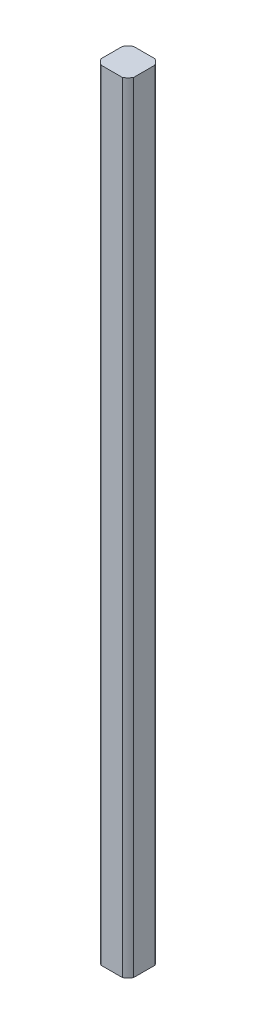
ISO-10303-21;
HEADER;
FILE_DESCRIPTION(('STEP AP214'),'2;1');
FILE_NAME('part.step','',(''),(''),'','','');
FILE_SCHEMA(('AUTOMOTIVE_DESIGN { 1 0 10303 214 1 1 1 1 }'));
ENDSEC;
DATA;
#1=APPLICATION_CONTEXT('core data for automotive mechanical design processes');
#2=APPLICATION_PROTOCOL_DEFINITION('international standard','automotive_design',2000,#1);
#3=PRODUCT_CONTEXT('',#1,'mechanical');
#4=PRODUCT('Part','Part','',(#3));
#5=PRODUCT_RELATED_PRODUCT_CATEGORY('part','',(#4));
#6=PRODUCT_DEFINITION_FORMATION('','',#4);
#7=PRODUCT_DEFINITION_CONTEXT('part definition',#1,'design');
#8=PRODUCT_DEFINITION('design','',#6,#7);
#9=PRODUCT_DEFINITION_SHAPE('','',#8);
#10=(LENGTH_UNIT() NAMED_UNIT(*) SI_UNIT(.MILLI.,.METRE.));
#11=(NAMED_UNIT(*) PLANE_ANGLE_UNIT() SI_UNIT($,.RADIAN.));
#12=(NAMED_UNIT(*) SI_UNIT($,.STERADIAN.) SOLID_ANGLE_UNIT());
#13=UNCERTAINTY_MEASURE_WITH_UNIT(LENGTH_MEASURE(1.E-05),#10,'distance_accuracy_value','');
#14=(GEOMETRIC_REPRESENTATION_CONTEXT(3) GLOBAL_UNCERTAINTY_ASSIGNED_CONTEXT((#13)) GLOBAL_UNIT_ASSIGNED_CONTEXT((#10,
#11,#12)) REPRESENTATION_CONTEXT('',''));
#15=CARTESIAN_POINT('',(0.,0.,0.));
#16=DIRECTION('',(0.,0.,1.));
#17=DIRECTION('',(1.,0.,0.));
#18=AXIS2_PLACEMENT_3D('',#15,#16,#17);
#19=CARTESIAN_POINT('',(0.,2400.,0.));
#20=DIRECTION('',(0.,-1.,0.));
#21=DIRECTION('',(0.,0.,-1.));
#22=AXIS2_PLACEMENT_3D('',#19,#20,#21);
#23=CYLINDRICAL_SURFACE('',#22,60.);
#24=CARTESIAN_POINT('',(0.,0.,0.));
#25=DIRECTION('',(0.,1.,0.));
#26=DIRECTION('',(0.,0.,1.));
#27=AXIS2_PLACEMENT_3D('',#24,#25,#26);
#28=CIRCLE('',#27,60.);
#29=CARTESIAN_POINT('',(-50.,0.,33.166247903554));
#30=VERTEX_POINT('',#29);
#31=CARTESIAN_POINT('',(-33.166247903554,0.,50.));
#32=VERTEX_POINT('',#31);
#33=EDGE_CURVE('E152',#30,#32,#28,.T.);
#34=ORIENTED_EDGE('',*,*,#33,.T.);
#35=DIRECTION('',(0.,-1.,0.));
#36=VECTOR('',#35,1.);
#37=CARTESIAN_POINT('',(-33.166247903554,2400.,50.));
#38=LINE('',#37,#36);
#39=CARTESIAN_POINT('',(-33.166247903554,2400.,50.));
#40=VERTEX_POINT('',#39);
#41=EDGE_CURVE('E12',#40,#32,#38,.T.);
#42=ORIENTED_EDGE('',*,*,#41,.F.);
#43=CARTESIAN_POINT('',(0.,2400.,0.));
#44=DIRECTION('',(0.,1.,0.));
#45=DIRECTION('',(0.,0.,1.));
#46=AXIS2_PLACEMENT_3D('',#43,#44,#45);
#47=CIRCLE('',#46,60.);
#48=CARTESIAN_POINT('',(-50.,2400.,33.166247903554));
#49=VERTEX_POINT('',#48);
#50=EDGE_CURVE('E210',#49,#40,#47,.T.);
#51=ORIENTED_EDGE('',*,*,#50,.F.);
#52=DIRECTION('',(0.,-1.,0.));
#53=VECTOR('',#52,1.);
#54=CARTESIAN_POINT('',(-50.,2400.,33.166247903554));
#55=LINE('',#54,#53);
#56=EDGE_CURVE('E147',#49,#30,#55,.T.);
#57=ORIENTED_EDGE('',*,*,#56,.T.);
#58=EDGE_LOOP('',(#34,#42,#51,#57));
#59=FACE_BOUND('',#58,.T.);
#60=ADVANCED_FACE('F49',(#59),#23,.T.);
#61=CARTESIAN_POINT('',(-33.166247903554,2400.,50.));
#62=DIRECTION('',(0.,0.,-1.));
#63=DIRECTION('',(-1.,0.,0.));
#64=AXIS2_PLACEMENT_3D('',#61,#62,#63);
#65=PLANE('',#64);
#66=DIRECTION('',(1.,0.,0.));
#67=VECTOR('',#66,1.);
#68=CARTESIAN_POINT('',(-33.166247903554,0.,50.));
#69=LINE('',#68,#67);
#70=CARTESIAN_POINT('',(33.166247903554,0.,50.));
#71=VERTEX_POINT('',#70);
#72=EDGE_CURVE('E156',#32,#71,#69,.T.);
#73=ORIENTED_EDGE('',*,*,#72,.T.);
#74=DIRECTION('',(0.,-1.,0.));
#75=VECTOR('',#74,1.);
#76=CARTESIAN_POINT('',(33.166247903554,2400.,50.));
#77=LINE('',#76,#75);
#78=CARTESIAN_POINT('',(33.166247903554,2400.,50.));
#79=VERTEX_POINT('',#78);
#80=EDGE_CURVE('E59',#79,#71,#77,.T.);
#81=ORIENTED_EDGE('',*,*,#80,.F.);
#82=DIRECTION('',(1.,0.,0.));
#83=VECTOR('',#82,1.);
#84=CARTESIAN_POINT('',(-33.166247903554,2400.,50.));
#85=LINE('',#84,#83);
#86=EDGE_CURVE('E110',#40,#79,#85,.T.);
#87=ORIENTED_EDGE('',*,*,#86,.F.);
#88=ORIENTED_EDGE('',*,*,#41,.T.);
#89=EDGE_LOOP('',(#73,#81,#87,#88));
#90=FACE_BOUND('',#89,.T.);
#91=ADVANCED_FACE('F226',(#90),#65,.F.);
#92=CARTESIAN_POINT('',(0.,2400.,0.));
#93=DIRECTION('',(0.,-1.,0.));
#94=DIRECTION('',(0.,0.,-1.));
#95=AXIS2_PLACEMENT_3D('',#92,#93,#94);
#96=CYLINDRICAL_SURFACE('',#95,60.);
#97=CARTESIAN_POINT('',(0.,0.,0.));
#98=DIRECTION('',(0.,1.,0.));
#99=DIRECTION('',(0.,0.,1.));
#100=AXIS2_PLACEMENT_3D('',#97,#98,#99);
#101=CIRCLE('',#100,60.);
#102=CARTESIAN_POINT('',(50.,0.,33.166247903554));
#103=VERTEX_POINT('',#102);
#104=EDGE_CURVE('E159',#71,#103,#101,.T.);
#105=ORIENTED_EDGE('',*,*,#104,.T.);
#106=DIRECTION('',(0.,-1.,0.));
#107=VECTOR('',#106,1.);
#108=CARTESIAN_POINT('',(50.,2400.,33.166247903554));
#109=LINE('',#108,#107);
#110=CARTESIAN_POINT('',(50.,2400.,33.166247903554));
#111=VERTEX_POINT('',#110);
#112=EDGE_CURVE('E175',#111,#103,#109,.T.);
#113=ORIENTED_EDGE('',*,*,#112,.F.);
#114=CARTESIAN_POINT('',(0.,2400.,0.));
#115=DIRECTION('',(0.,1.,0.));
#116=DIRECTION('',(0.,0.,1.));
#117=AXIS2_PLACEMENT_3D('',#114,#115,#116);
#118=CIRCLE('',#117,60.);
#119=EDGE_CURVE('E189',#79,#111,#118,.T.);
#120=ORIENTED_EDGE('',*,*,#119,.F.);
#121=ORIENTED_EDGE('',*,*,#80,.T.);
#122=EDGE_LOOP('',(#105,#113,#120,#121));
#123=FACE_BOUND('',#122,.T.);
#124=ADVANCED_FACE('F187',(#123),#96,.T.);
#125=CARTESIAN_POINT('',(50.,2400.,-33.166247903554));
#126=DIRECTION('',(-1.,0.,0.));
#127=DIRECTION('',(0.,0.,1.));
#128=AXIS2_PLACEMENT_3D('',#125,#126,#127);
#129=PLANE('',#128);
#130=DIRECTION('',(0.,0.,-1.));
#131=VECTOR('',#130,1.);
#132=CARTESIAN_POINT('',(50.,0.,-33.166247903554));
#133=LINE('',#132,#131);
#134=CARTESIAN_POINT('',(50.,0.,-33.166247903554));
#135=VERTEX_POINT('',#134);
#136=EDGE_CURVE('E162',#103,#135,#133,.T.);
#137=ORIENTED_EDGE('',*,*,#136,.T.);
#138=DIRECTION('',(0.,-1.,0.));
#139=VECTOR('',#138,1.);
#140=CARTESIAN_POINT('',(50.,2400.,-33.166247903554));
#141=LINE('',#140,#139);
#142=CARTESIAN_POINT('',(50.,2400.,-33.166247903554));
#143=VERTEX_POINT('',#142);
#144=EDGE_CURVE('E180',#143,#135,#141,.T.);
#145=ORIENTED_EDGE('',*,*,#144,.F.);
#146=DIRECTION('',(0.,0.,-1.));
#147=VECTOR('',#146,1.);
#148=CARTESIAN_POINT('',(50.,2400.,-33.166247903554));
#149=LINE('',#148,#147);
#150=EDGE_CURVE('E219',#111,#143,#149,.T.);
#151=ORIENTED_EDGE('',*,*,#150,.F.);
#152=ORIENTED_EDGE('',*,*,#112,.T.);
#153=EDGE_LOOP('',(#137,#145,#151,#152));
#154=FACE_BOUND('',#153,.T.);
#155=ADVANCED_FACE('F198',(#154),#129,.F.);
#156=CARTESIAN_POINT('',(0.,2400.,0.));
#157=DIRECTION('',(0.,-1.,0.));
#158=DIRECTION('',(0.,0.,-1.));
#159=AXIS2_PLACEMENT_3D('',#156,#157,#158);
#160=CYLINDRICAL_SURFACE('',#159,60.);
#161=CARTESIAN_POINT('',(0.,0.,0.));
#162=DIRECTION('',(0.,1.,0.));
#163=DIRECTION('',(0.,0.,1.));
#164=AXIS2_PLACEMENT_3D('',#161,#162,#163);
#165=CIRCLE('',#164,60.);
#166=CARTESIAN_POINT('',(33.166247903554,0.,-50.));
#167=VERTEX_POINT('',#166);
#168=EDGE_CURVE('E165',#135,#167,#165,.T.);
#169=ORIENTED_EDGE('',*,*,#168,.T.);
#170=DIRECTION('',(0.,-1.,0.));
#171=VECTOR('',#170,1.);
#172=CARTESIAN_POINT('',(33.166247903554,2400.,-50.));
#173=LINE('',#172,#171);
#174=CARTESIAN_POINT('',(33.166247903554,2400.,-50.));
#175=VERTEX_POINT('',#174);
#176=EDGE_CURVE('E140',#175,#167,#173,.T.);
#177=ORIENTED_EDGE('',*,*,#176,.F.);
#178=CARTESIAN_POINT('',(0.,2400.,0.));
#179=DIRECTION('',(0.,1.,0.));
#180=DIRECTION('',(0.,0.,1.));
#181=AXIS2_PLACEMENT_3D('',#178,#179,#180);
#182=CIRCLE('',#181,60.);
#183=EDGE_CURVE('E129',#143,#175,#182,.T.);
#184=ORIENTED_EDGE('',*,*,#183,.F.);
#185=ORIENTED_EDGE('',*,*,#144,.T.);
#186=EDGE_LOOP('',(#169,#177,#184,#185));
#187=FACE_BOUND('',#186,.T.);
#188=ADVANCED_FACE('F201',(#187),#160,.T.);
#189=CARTESIAN_POINT('',(-33.166247903554,2400.,-50.));
#190=DIRECTION('',(0.,0.,1.));
#191=DIRECTION('',(1.,0.,0.));
#192=AXIS2_PLACEMENT_3D('',#189,#190,#191);
#193=PLANE('',#192);
#194=DIRECTION('',(-1.,0.,0.));
#195=VECTOR('',#194,1.);
#196=CARTESIAN_POINT('',(-33.166247903554,0.,-50.));
#197=LINE('',#196,#195);
#198=CARTESIAN_POINT('',(-33.166247903554,0.,-50.));
#199=VERTEX_POINT('',#198);
#200=EDGE_CURVE('E138',#167,#199,#197,.T.);
#201=ORIENTED_EDGE('',*,*,#200,.T.);
#202=DIRECTION('',(0.,-1.,0.));
#203=VECTOR('',#202,1.);
#204=CARTESIAN_POINT('',(-33.166247903554,2400.,-50.));
#205=LINE('',#204,#203);
#206=CARTESIAN_POINT('',(-33.166247903554,2400.,-50.));
#207=VERTEX_POINT('',#206);
#208=EDGE_CURVE('E135',#207,#199,#205,.T.);
#209=ORIENTED_EDGE('',*,*,#208,.F.);
#210=DIRECTION('',(-1.,0.,0.));
#211=VECTOR('',#210,1.);
#212=CARTESIAN_POINT('',(-33.166247903554,2400.,-50.));
#213=LINE('',#212,#211);
#214=EDGE_CURVE('E123',#175,#207,#213,.T.);
#215=ORIENTED_EDGE('',*,*,#214,.F.);
#216=ORIENTED_EDGE('',*,*,#176,.T.);
#217=EDGE_LOOP('',(#201,#209,#215,#216));
#218=FACE_BOUND('',#217,.T.);
#219=ADVANCED_FACE('F136',(#218),#193,.F.);
#220=CARTESIAN_POINT('',(0.,2400.,0.));
#221=DIRECTION('',(0.,-1.,0.));
#222=DIRECTION('',(0.,0.,-1.));
#223=AXIS2_PLACEMENT_3D('',#220,#221,#222);
#224=CYLINDRICAL_SURFACE('',#223,60.);
#225=CARTESIAN_POINT('',(0.,0.,0.));
#226=DIRECTION('',(0.,1.,0.));
#227=DIRECTION('',(0.,0.,1.));
#228=AXIS2_PLACEMENT_3D('',#225,#226,#227);
#229=CIRCLE('',#228,60.);
#230=CARTESIAN_POINT('',(-50.,0.,-33.166247903554));
#231=VERTEX_POINT('',#230);
#232=EDGE_CURVE('E96',#199,#231,#229,.T.);
#233=ORIENTED_EDGE('',*,*,#232,.T.);
#234=DIRECTION('',(0.,-1.,0.));
#235=VECTOR('',#234,1.);
#236=CARTESIAN_POINT('',(-50.,2400.,-33.166247903554));
#237=LINE('',#236,#235);
#238=CARTESIAN_POINT('',(-50.,2400.,-33.166247903554));
#239=VERTEX_POINT('',#238);
#240=EDGE_CURVE('E141',#239,#231,#237,.T.);
#241=ORIENTED_EDGE('',*,*,#240,.F.);
#242=CARTESIAN_POINT('',(0.,2400.,0.));
#243=DIRECTION('',(0.,1.,0.));
#244=DIRECTION('',(0.,0.,1.));
#245=AXIS2_PLACEMENT_3D('',#242,#243,#244);
#246=CIRCLE('',#245,60.);
#247=EDGE_CURVE('E127',#207,#239,#246,.T.);
#248=ORIENTED_EDGE('',*,*,#247,.F.);
#249=ORIENTED_EDGE('',*,*,#208,.T.);
#250=EDGE_LOOP('',(#233,#241,#248,#249));
#251=FACE_BOUND('',#250,.T.);
#252=ADVANCED_FACE('F143',(#251),#224,.T.);
#253=CARTESIAN_POINT('',(-50.,2400.,-33.166247903554));
#254=DIRECTION('',(1.,0.,0.));
#255=DIRECTION('',(0.,0.,-1.));
#256=AXIS2_PLACEMENT_3D('',#253,#254,#255);
#257=PLANE('',#256);
#258=DIRECTION('',(0.,0.,1.));
#259=VECTOR('',#258,1.);
#260=CARTESIAN_POINT('',(-50.,0.,-33.166247903554));
#261=LINE('',#260,#259);
#262=EDGE_CURVE('E102',#231,#30,#261,.T.);
#263=ORIENTED_EDGE('',*,*,#262,.T.);
#264=ORIENTED_EDGE('',*,*,#56,.F.);
#265=DIRECTION('',(0.,0.,1.));
#266=VECTOR('',#265,1.);
#267=CARTESIAN_POINT('',(-50.,2400.,-33.166247903554));
#268=LINE('',#267,#266);
#269=EDGE_CURVE('E67',#239,#49,#268,.T.);
#270=ORIENTED_EDGE('',*,*,#269,.F.);
#271=ORIENTED_EDGE('',*,*,#240,.T.);
#272=EDGE_LOOP('',(#263,#264,#270,#271));
#273=FACE_BOUND('',#272,.T.);
#274=ADVANCED_FACE('F242',(#273),#257,.F.);
#275=CARTESIAN_POINT('',(0.,2400.,0.));
#276=DIRECTION('',(0.,1.,0.));
#277=DIRECTION('',(0.,0.,1.));
#278=AXIS2_PLACEMENT_3D('',#275,#276,#277);
#279=PLANE('',#278);
#280=ORIENTED_EDGE('',*,*,#50,.T.);
#281=ORIENTED_EDGE('',*,*,#86,.T.);
#282=ORIENTED_EDGE('',*,*,#119,.T.);
#283=ORIENTED_EDGE('',*,*,#150,.T.);
#284=ORIENTED_EDGE('',*,*,#183,.T.);
#285=ORIENTED_EDGE('',*,*,#214,.T.);
#286=ORIENTED_EDGE('',*,*,#247,.T.);
#287=ORIENTED_EDGE('',*,*,#269,.T.);
#288=EDGE_LOOP('',(#280,#281,#282,#283,#284,#285,#286,#287));
#289=FACE_BOUND('',#288,.T.);
#290=ADVANCED_FACE('F125',(#289),#279,.T.);
#291=CARTESIAN_POINT('',(0.,0.,0.));
#292=DIRECTION('',(0.,1.,0.));
#293=DIRECTION('',(0.,0.,1.));
#294=AXIS2_PLACEMENT_3D('',#291,#292,#293);
#295=PLANE('',#294);
#296=ORIENTED_EDGE('',*,*,#33,.F.);
#297=ORIENTED_EDGE('',*,*,#262,.F.);
#298=ORIENTED_EDGE('',*,*,#232,.F.);
#299=ORIENTED_EDGE('',*,*,#200,.F.);
#300=ORIENTED_EDGE('',*,*,#168,.F.);
#301=ORIENTED_EDGE('',*,*,#136,.F.);
#302=ORIENTED_EDGE('',*,*,#104,.F.);
#303=ORIENTED_EDGE('',*,*,#72,.F.);
#304=EDGE_LOOP('',(#296,#297,#298,#299,#300,#301,#302,#303));
#305=FACE_BOUND('',#304,.T.);
#306=ADVANCED_FACE('F193',(#305),#295,.F.);
#307=CLOSED_SHELL('',(#60,#91,#124,#155,#188,#219,#252,#274,#290,#306));
#308=MANIFOLD_SOLID_BREP('B2',#307);
#309=ADVANCED_BREP_SHAPE_REPRESENTATION('',(#18,#308),#14);
#310=SHAPE_DEFINITION_REPRESENTATION(#9,#309);
ENDSEC;
END-ISO-10303-21;
